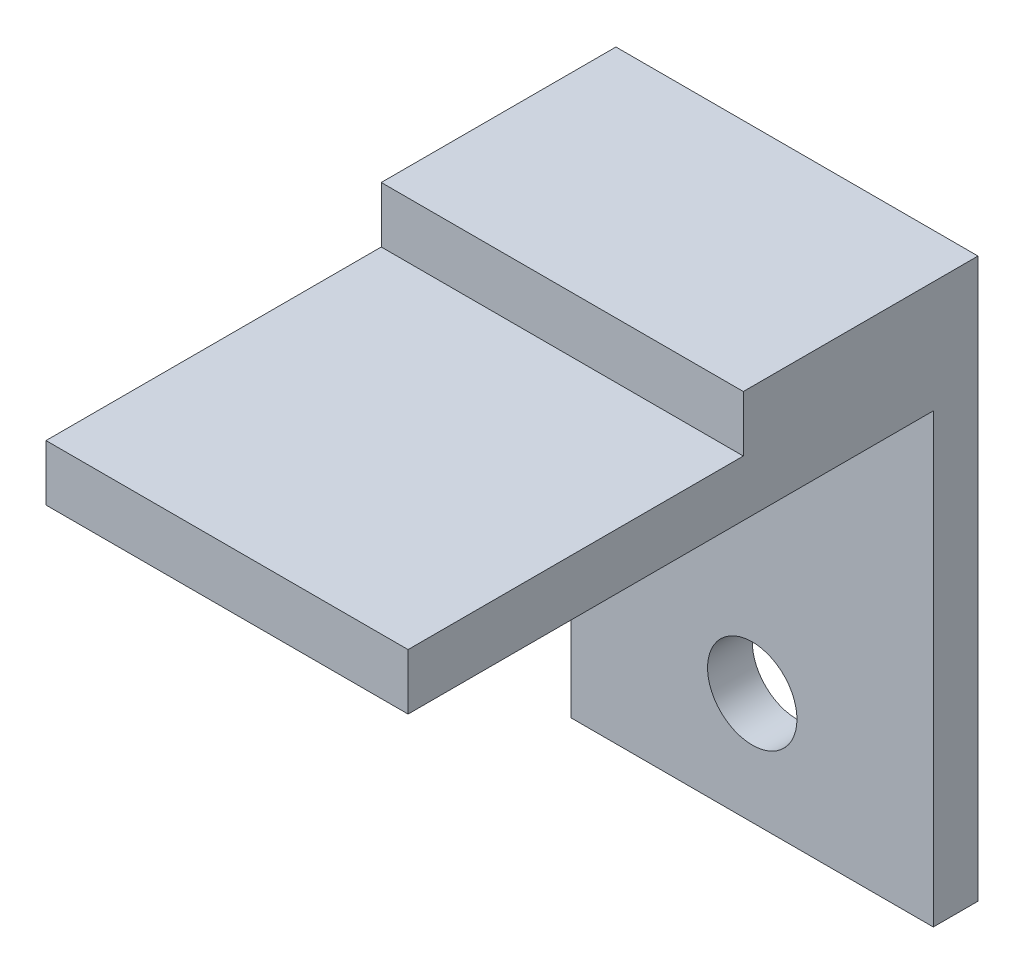
ISO-10303-21;
HEADER;
FILE_DESCRIPTION(('STEP AP214'),'2;1');
FILE_NAME('part.step','',(''),(''),'','','');
FILE_SCHEMA(('AUTOMOTIVE_DESIGN { 1 0 10303 214 1 1 1 1 }'));
ENDSEC;
DATA;
#1=APPLICATION_CONTEXT('core data for automotive mechanical design processes');
#2=APPLICATION_PROTOCOL_DEFINITION('international standard','automotive_design',2000,#1);
#3=PRODUCT_CONTEXT('',#1,'mechanical');
#4=PRODUCT('Part','Part','',(#3));
#5=PRODUCT_RELATED_PRODUCT_CATEGORY('part','',(#4));
#6=PRODUCT_DEFINITION_FORMATION('','',#4);
#7=PRODUCT_DEFINITION_CONTEXT('part definition',#1,'design');
#8=PRODUCT_DEFINITION('design','',#6,#7);
#9=PRODUCT_DEFINITION_SHAPE('','',#8);
#10=(LENGTH_UNIT() NAMED_UNIT(*) SI_UNIT(.MILLI.,.METRE.));
#11=(NAMED_UNIT(*) PLANE_ANGLE_UNIT() SI_UNIT($,.RADIAN.));
#12=(NAMED_UNIT(*) SI_UNIT($,.STERADIAN.) SOLID_ANGLE_UNIT());
#13=UNCERTAINTY_MEASURE_WITH_UNIT(LENGTH_MEASURE(1.E-05),#10,'distance_accuracy_value','');
#14=(GEOMETRIC_REPRESENTATION_CONTEXT(3) GLOBAL_UNCERTAINTY_ASSIGNED_CONTEXT((#13)) GLOBAL_UNIT_ASSIGNED_CONTEXT((#10,
#11,#12)) REPRESENTATION_CONTEXT('',''));
#15=CARTESIAN_POINT('',(0.,0.,0.));
#16=DIRECTION('',(0.,0.,1.));
#17=DIRECTION('',(1.,0.,0.));
#18=AXIS2_PLACEMENT_3D('',#15,#16,#17);
#19=CARTESIAN_POINT('',(0.,9.99999999999999,25.5));
#20=DIRECTION('',(0.,-1.,0.));
#21=DIRECTION('',(1.,0.,0.));
#22=AXIS2_PLACEMENT_3D('',#19,#20,#21);
#23=PLANE('',#22);
#24=DIRECTION('',(-1.,0.,0.));
#25=VECTOR('',#24,1.);
#26=CARTESIAN_POINT('',(0.,9.99999999999999,25.5));
#27=LINE('',#26,#25);
#28=CARTESIAN_POINT('',(8.1,10.,25.5));
#29=VERTEX_POINT('',#28);
#30=CARTESIAN_POINT('',(-8.1,9.99999999999999,25.5));
#31=VERTEX_POINT('',#30);
#32=EDGE_CURVE('E136',#29,#31,#27,.T.);
#33=ORIENTED_EDGE('',*,*,#32,.F.);
#34=DIRECTION('',(0.,0.,-1.));
#35=VECTOR('',#34,1.);
#36=CARTESIAN_POINT('',(8.1,10.,25.5));
#37=LINE('',#36,#35);
#38=CARTESIAN_POINT('',(8.1,10.,10.5));
#39=VERTEX_POINT('',#38);
#40=EDGE_CURVE('E138',#29,#39,#37,.T.);
#41=ORIENTED_EDGE('',*,*,#40,.T.);
#42=DIRECTION('',(-1.,0.,0.));
#43=VECTOR('',#42,1.);
#44=CARTESIAN_POINT('',(0.,9.99999999999999,10.5));
#45=LINE('',#44,#43);
#46=CARTESIAN_POINT('',(-8.1,9.99999999999999,10.5));
#47=VERTEX_POINT('',#46);
#48=EDGE_CURVE('E11',#39,#47,#45,.T.);
#49=ORIENTED_EDGE('',*,*,#48,.T.);
#50=DIRECTION('',(0.,0.,-1.));
#51=VECTOR('',#50,1.);
#52=CARTESIAN_POINT('',(-8.1,9.99999999999999,25.5));
#53=LINE('',#52,#51);
#54=EDGE_CURVE('E48',#31,#47,#53,.T.);
#55=ORIENTED_EDGE('',*,*,#54,.F.);
#56=EDGE_LOOP('',(#33,#41,#49,#55));
#57=FACE_BOUND('',#56,.T.);
#58=ADVANCED_FACE('F45',(#57),#23,.F.);
#59=CARTESIAN_POINT('',(-8.1,0.,25.5));
#60=DIRECTION('',(1.,0.,0.));
#61=DIRECTION('',(0.,1.,0.));
#62=AXIS2_PLACEMENT_3D('',#59,#60,#61);
#63=PLANE('',#62);
#64=DIRECTION('',(0.,-1.,0.));
#65=VECTOR('',#64,1.);
#66=CARTESIAN_POINT('',(-8.1,0.,0.));
#67=LINE('',#66,#65);
#68=CARTESIAN_POINT('',(-8.1,12.5,0.));
#69=VERTEX_POINT('',#68);
#70=CARTESIAN_POINT('',(-8.10000000000001,-12.5,0.));
#71=VERTEX_POINT('',#70);
#72=EDGE_CURVE('E145',#69,#71,#67,.T.);
#73=ORIENTED_EDGE('',*,*,#72,.T.);
#74=DIRECTION('',(0.,0.,-1.));
#75=VECTOR('',#74,1.);
#76=CARTESIAN_POINT('',(-8.10000000000001,-12.5,2.));
#77=LINE('',#76,#75);
#78=CARTESIAN_POINT('',(-8.10000000000001,-12.5,2.));
#79=VERTEX_POINT('',#78);
#80=EDGE_CURVE('E250',#79,#71,#77,.T.);
#81=ORIENTED_EDGE('',*,*,#80,.F.);
#82=DIRECTION('',(0.,-1.,0.));
#83=VECTOR('',#82,1.);
#84=CARTESIAN_POINT('',(-8.1,0.,2.));
#85=LINE('',#84,#83);
#86=CARTESIAN_POINT('',(-8.1,7.5,2.));
#87=VERTEX_POINT('',#86);
#88=EDGE_CURVE('E258',#87,#79,#85,.T.);
#89=ORIENTED_EDGE('',*,*,#88,.F.);
#90=DIRECTION('',(0.,0.,-1.));
#91=VECTOR('',#90,1.);
#92=CARTESIAN_POINT('',(-8.1,7.5,25.5));
#93=LINE('',#92,#91);
#94=CARTESIAN_POINT('',(-8.1,7.5,25.5));
#95=VERTEX_POINT('',#94);
#96=EDGE_CURVE('E269',#95,#87,#93,.T.);
#97=ORIENTED_EDGE('',*,*,#96,.F.);
#98=DIRECTION('',(0.,-1.,0.));
#99=VECTOR('',#98,1.);
#100=CARTESIAN_POINT('',(-8.1,0.,25.5));
#101=LINE('',#100,#99);
#102=EDGE_CURVE('E144',#31,#95,#101,.T.);
#103=ORIENTED_EDGE('',*,*,#102,.F.);
#104=ORIENTED_EDGE('',*,*,#54,.T.);
#105=DIRECTION('',(0.,-1.,0.));
#106=VECTOR('',#105,1.);
#107=CARTESIAN_POINT('',(-8.1,0.,10.5));
#108=LINE('',#107,#106);
#109=CARTESIAN_POINT('',(-8.1,12.5,10.5));
#110=VERTEX_POINT('',#109);
#111=EDGE_CURVE('E69',#110,#47,#108,.T.);
#112=ORIENTED_EDGE('',*,*,#111,.F.);
#113=DIRECTION('',(0.,0.,-1.));
#114=VECTOR('',#113,1.);
#115=CARTESIAN_POINT('',(-8.1,12.5,10.5));
#116=LINE('',#115,#114);
#117=EDGE_CURVE('E176',#110,#69,#116,.T.);
#118=ORIENTED_EDGE('',*,*,#117,.T.);
#119=EDGE_LOOP('',(#73,#81,#89,#97,#103,#104,#112,#118));
#120=FACE_BOUND('',#119,.T.);
#121=ADVANCED_FACE('F275',(#120),#63,.F.);
#122=CARTESIAN_POINT('',(0.,7.5,25.5));
#123=DIRECTION('',(0.,-1.,0.));
#124=DIRECTION('',(1.,0.,0.));
#125=AXIS2_PLACEMENT_3D('',#122,#123,#124);
#126=PLANE('',#125);
#127=DIRECTION('',(-1.,0.,0.));
#128=VECTOR('',#127,1.);
#129=CARTESIAN_POINT('',(0.,7.5,2.));
#130=LINE('',#129,#128);
#131=CARTESIAN_POINT('',(8.1,7.5,2.));
#132=VERTEX_POINT('',#131);
#133=EDGE_CURVE('E54',#132,#87,#130,.T.);
#134=ORIENTED_EDGE('',*,*,#133,.F.);
#135=DIRECTION('',(0.,0.,-1.));
#136=VECTOR('',#135,1.);
#137=CARTESIAN_POINT('',(8.1,7.5,25.5));
#138=LINE('',#137,#136);
#139=CARTESIAN_POINT('',(8.1,7.5,25.5));
#140=VERTEX_POINT('',#139);
#141=EDGE_CURVE('E158',#140,#132,#138,.T.);
#142=ORIENTED_EDGE('',*,*,#141,.F.);
#143=DIRECTION('',(-1.,0.,0.));
#144=VECTOR('',#143,1.);
#145=CARTESIAN_POINT('',(0.,7.5,25.5));
#146=LINE('',#145,#144);
#147=EDGE_CURVE('E162',#140,#95,#146,.T.);
#148=ORIENTED_EDGE('',*,*,#147,.T.);
#149=ORIENTED_EDGE('',*,*,#96,.T.);
#150=EDGE_LOOP('',(#134,#142,#148,#149));
#151=FACE_BOUND('',#150,.T.);
#152=ADVANCED_FACE('F278',(#151),#126,.T.);
#153=CARTESIAN_POINT('',(0.,0.,25.5));
#154=DIRECTION('',(0.,0.,1.));
#155=DIRECTION('',(1.,0.,0.));
#156=AXIS2_PLACEMENT_3D('',#153,#154,#155);
#157=PLANE('',#156);
#158=ORIENTED_EDGE('',*,*,#147,.F.);
#159=DIRECTION('',(0.,-1.,0.));
#160=VECTOR('',#159,1.);
#161=CARTESIAN_POINT('',(8.1,0.,25.5));
#162=LINE('',#161,#160);
#163=EDGE_CURVE('E153',#29,#140,#162,.T.);
#164=ORIENTED_EDGE('',*,*,#163,.F.);
#165=ORIENTED_EDGE('',*,*,#32,.T.);
#166=ORIENTED_EDGE('',*,*,#102,.T.);
#167=EDGE_LOOP('',(#158,#164,#165,#166));
#168=FACE_BOUND('',#167,.T.);
#169=ADVANCED_FACE('F160',(#168),#157,.T.);
#170=CARTESIAN_POINT('',(0.,0.,0.));
#171=DIRECTION('',(0.,0.,1.));
#172=DIRECTION('',(1.,0.,0.));
#173=AXIS2_PLACEMENT_3D('',#170,#171,#172);
#174=PLANE('',#173);
#175=DIRECTION('',(0.,-1.,0.));
#176=VECTOR('',#175,1.);
#177=CARTESIAN_POINT('',(8.1,0.,0.));
#178=LINE('',#177,#176);
#179=CARTESIAN_POINT('',(8.1,12.5,0.));
#180=VERTEX_POINT('',#179);
#181=CARTESIAN_POINT('',(8.1,-12.5,0.));
#182=VERTEX_POINT('',#181);
#183=EDGE_CURVE('E254',#180,#182,#178,.T.);
#184=ORIENTED_EDGE('',*,*,#183,.T.);
#185=DIRECTION('',(1.,0.,0.));
#186=VECTOR('',#185,1.);
#187=CARTESIAN_POINT('',(0.,-12.5,0.));
#188=LINE('',#187,#186);
#189=EDGE_CURVE('E237',#71,#182,#188,.T.);
#190=ORIENTED_EDGE('',*,*,#189,.F.);
#191=ORIENTED_EDGE('',*,*,#72,.F.);
#192=DIRECTION('',(1.,0.,0.));
#193=VECTOR('',#192,1.);
#194=CARTESIAN_POINT('',(0.,12.5,0.));
#195=LINE('',#194,#193);
#196=EDGE_CURVE('E157',#69,#180,#195,.T.);
#197=ORIENTED_EDGE('',*,*,#196,.T.);
#198=EDGE_LOOP('',(#184,#190,#191,#197));
#199=FACE_BOUND('',#198,.T.);
#200=DIRECTION('',(0.,-1.,0.));
#201=VECTOR('',#200,1.);
#202=CARTESIAN_POINT('',(1.,0.,0.));
#203=LINE('',#202,#201);
#204=CARTESIAN_POINT('',(1.,-0.499999999999997,0.));
#205=VERTEX_POINT('',#204);
#206=CARTESIAN_POINT('',(1.,-2.5,0.));
#207=VERTEX_POINT('',#206);
#208=EDGE_CURVE('E187',#205,#207,#203,.T.);
#209=ORIENTED_EDGE('',*,*,#208,.F.);
#210=DIRECTION('',(1.,0.,0.));
#211=VECTOR('',#210,1.);
#212=CARTESIAN_POINT('',(0.,-0.499999999999997,0.));
#213=LINE('',#212,#211);
#214=CARTESIAN_POINT('',(-1.,-0.499999999999996,0.));
#215=VERTEX_POINT('',#214);
#216=EDGE_CURVE('E207',#215,#205,#213,.T.);
#217=ORIENTED_EDGE('',*,*,#216,.F.);
#218=DIRECTION('',(0.,-1.,0.));
#219=VECTOR('',#218,1.);
#220=CARTESIAN_POINT('',(-1.,0.,0.));
#221=LINE('',#220,#219);
#222=CARTESIAN_POINT('',(-1.,-2.5,0.));
#223=VERTEX_POINT('',#222);
#224=EDGE_CURVE('E211',#215,#223,#221,.T.);
#225=ORIENTED_EDGE('',*,*,#224,.T.);
#226=DIRECTION('',(1.,0.,0.));
#227=VECTOR('',#226,1.);
#228=CARTESIAN_POINT('',(0.,-2.5,0.));
#229=LINE('',#228,#227);
#230=EDGE_CURVE('E192',#223,#207,#229,.T.);
#231=ORIENTED_EDGE('',*,*,#230,.T.);
#232=EDGE_LOOP('',(#209,#217,#225,#231));
#233=FACE_BOUND('',#232,.T.);
#234=CARTESIAN_POINT('',(0.,-7.5,0.));
#235=DIRECTION('',(0.,0.,1.));
#236=DIRECTION('',(1.,0.,0.));
#237=AXIS2_PLACEMENT_3D('',#234,#235,#236);
#238=CIRCLE('',#237,2.);
#239=CARTESIAN_POINT('',(2.,-7.5,0.));
#240=VERTEX_POINT('',#239);
#241=EDGE_CURVE('E220',#240,#240,#238,.T.);
#242=ORIENTED_EDGE('',*,*,#241,.T.);
#243=EDGE_LOOP('',(#242));
#244=FACE_BOUND('',#243,.T.);
#245=ADVANCED_FACE('F288',(#199,#233,#244),#174,.F.);
#246=CARTESIAN_POINT('',(8.1,0.,2.));
#247=DIRECTION('',(1.,0.,0.));
#248=DIRECTION('',(0.,0.,-1.));
#249=AXIS2_PLACEMENT_3D('',#246,#247,#248);
#250=PLANE('',#249);
#251=DIRECTION('',(0.,0.,-1.));
#252=VECTOR('',#251,1.);
#253=CARTESIAN_POINT('',(8.1,-12.5,2.));
#254=LINE('',#253,#252);
#255=CARTESIAN_POINT('',(8.1,-12.5,2.));
#256=VERTEX_POINT('',#255);
#257=EDGE_CURVE('E241',#256,#182,#254,.T.);
#258=ORIENTED_EDGE('',*,*,#257,.T.);
#259=ORIENTED_EDGE('',*,*,#183,.F.);
#260=DIRECTION('',(0.,0.,-1.));
#261=VECTOR('',#260,1.);
#262=CARTESIAN_POINT('',(8.1,12.5,10.5));
#263=LINE('',#262,#261);
#264=CARTESIAN_POINT('',(8.1,12.5,10.5));
#265=VERTEX_POINT('',#264);
#266=EDGE_CURVE('E183',#265,#180,#263,.T.);
#267=ORIENTED_EDGE('',*,*,#266,.F.);
#268=DIRECTION('',(0.,-1.,0.));
#269=VECTOR('',#268,1.);
#270=CARTESIAN_POINT('',(8.1,0.,10.5));
#271=LINE('',#270,#269);
#272=EDGE_CURVE('E155',#265,#39,#271,.T.);
#273=ORIENTED_EDGE('',*,*,#272,.T.);
#274=ORIENTED_EDGE('',*,*,#40,.F.);
#275=ORIENTED_EDGE('',*,*,#163,.T.);
#276=ORIENTED_EDGE('',*,*,#141,.T.);
#277=DIRECTION('',(0.,-1.,0.));
#278=VECTOR('',#277,1.);
#279=CARTESIAN_POINT('',(8.1,0.,2.));
#280=LINE('',#279,#278);
#281=EDGE_CURVE('E255',#132,#256,#280,.T.);
#282=ORIENTED_EDGE('',*,*,#281,.T.);
#283=EDGE_LOOP('',(#258,#259,#267,#273,#274,#275,#276,#282));
#284=FACE_BOUND('',#283,.T.);
#285=ADVANCED_FACE('F151',(#284),#250,.T.);
#286=CARTESIAN_POINT('',(0.,0.,2.));
#287=DIRECTION('',(0.,0.,1.));
#288=DIRECTION('',(1.,0.,0.));
#289=AXIS2_PLACEMENT_3D('',#286,#287,#288);
#290=PLANE('',#289);
#291=ORIENTED_EDGE('',*,*,#281,.F.);
#292=ORIENTED_EDGE('',*,*,#133,.T.);
#293=ORIENTED_EDGE('',*,*,#88,.T.);
#294=DIRECTION('',(1.,0.,0.));
#295=VECTOR('',#294,1.);
#296=CARTESIAN_POINT('',(0.,-12.5,2.));
#297=LINE('',#296,#295);
#298=EDGE_CURVE('E236',#79,#256,#297,.T.);
#299=ORIENTED_EDGE('',*,*,#298,.T.);
#300=EDGE_LOOP('',(#291,#292,#293,#299));
#301=FACE_BOUND('',#300,.T.);
#302=CARTESIAN_POINT('',(0.,-7.5,2.));
#303=DIRECTION('',(0.,0.,1.));
#304=DIRECTION('',(1.,0.,0.));
#305=AXIS2_PLACEMENT_3D('',#302,#303,#304);
#306=CIRCLE('',#305,2.);
#307=CARTESIAN_POINT('',(2.,-7.5,2.));
#308=VERTEX_POINT('',#307);
#309=EDGE_CURVE('E232',#308,#308,#306,.T.);
#310=ORIENTED_EDGE('',*,*,#309,.F.);
#311=EDGE_LOOP('',(#310));
#312=FACE_BOUND('',#311,.T.);
#313=ADVANCED_FACE('F282',(#301,#312),#290,.T.);
#314=CARTESIAN_POINT('',(0.,-12.5,2.));
#315=DIRECTION('',(0.,1.,0.));
#316=DIRECTION('',(-1.,0.,0.));
#317=AXIS2_PLACEMENT_3D('',#314,#315,#316);
#318=PLANE('',#317);
#319=ORIENTED_EDGE('',*,*,#189,.T.);
#320=ORIENTED_EDGE('',*,*,#257,.F.);
#321=ORIENTED_EDGE('',*,*,#298,.F.);
#322=ORIENTED_EDGE('',*,*,#80,.T.);
#323=EDGE_LOOP('',(#319,#320,#321,#322));
#324=FACE_BOUND('',#323,.T.);
#325=ADVANCED_FACE('F285',(#324),#318,.F.);
#326=CARTESIAN_POINT('',(0.,-7.5,2.));
#327=DIRECTION('',(0.,0.,-1.));
#328=DIRECTION('',(-1.,0.,0.));
#329=AXIS2_PLACEMENT_3D('',#326,#327,#328);
#330=CYLINDRICAL_SURFACE('',#329,2.);
#331=ORIENTED_EDGE('',*,*,#309,.T.);
#332=EDGE_LOOP('',(#331));
#333=FACE_BOUND('',#332,.T.);
#334=ORIENTED_EDGE('',*,*,#241,.F.);
#335=EDGE_LOOP('',(#334));
#336=FACE_BOUND('',#335,.T.);
#337=ADVANCED_FACE('F318',(#333,#336),#330,.F.);
#338=CARTESIAN_POINT('',(1.,0.,-1.5));
#339=DIRECTION('',(-1.,0.,0.));
#340=DIRECTION('',(0.,-1.,0.));
#341=AXIS2_PLACEMENT_3D('',#338,#339,#340);
#342=PLANE('',#341);
#343=ORIENTED_EDGE('',*,*,#208,.T.);
#344=DIRECTION('',(0.,0.,1.));
#345=VECTOR('',#344,1.);
#346=CARTESIAN_POINT('',(1.,-2.5,-1.5));
#347=LINE('',#346,#345);
#348=CARTESIAN_POINT('',(1.,-2.5,-1.5));
#349=VERTEX_POINT('',#348);
#350=EDGE_CURVE('E216',#349,#207,#347,.T.);
#351=ORIENTED_EDGE('',*,*,#350,.F.);
#352=DIRECTION('',(0.,-1.,0.));
#353=VECTOR('',#352,1.);
#354=CARTESIAN_POINT('',(1.,0.,-1.5));
#355=LINE('',#354,#353);
#356=CARTESIAN_POINT('',(1.,-0.499999999999997,-1.5));
#357=VERTEX_POINT('',#356);
#358=EDGE_CURVE('E188',#357,#349,#355,.T.);
#359=ORIENTED_EDGE('',*,*,#358,.F.);
#360=DIRECTION('',(0.,0.,1.));
#361=VECTOR('',#360,1.);
#362=CARTESIAN_POINT('',(1.,-0.499999999999997,-1.5));
#363=LINE('',#362,#361);
#364=EDGE_CURVE('E203',#357,#205,#363,.T.);
#365=ORIENTED_EDGE('',*,*,#364,.T.);
#366=EDGE_LOOP('',(#343,#351,#359,#365));
#367=FACE_BOUND('',#366,.T.);
#368=ADVANCED_FACE('F321',(#367),#342,.F.);
#369=CARTESIAN_POINT('',(0.,-2.5,-1.5));
#370=DIRECTION('',(0.,-1.,0.));
#371=DIRECTION('',(1.,0.,0.));
#372=AXIS2_PLACEMENT_3D('',#369,#370,#371);
#373=PLANE('',#372);
#374=ORIENTED_EDGE('',*,*,#230,.F.);
#375=DIRECTION('',(0.,0.,1.));
#376=VECTOR('',#375,1.);
#377=CARTESIAN_POINT('',(-1.,-2.5,-1.5));
#378=LINE('',#377,#376);
#379=CARTESIAN_POINT('',(-1.,-2.5,-1.5));
#380=VERTEX_POINT('',#379);
#381=EDGE_CURVE('E221',#380,#223,#378,.T.);
#382=ORIENTED_EDGE('',*,*,#381,.F.);
#383=DIRECTION('',(1.,0.,0.));
#384=VECTOR('',#383,1.);
#385=CARTESIAN_POINT('',(0.,-2.5,-1.5));
#386=LINE('',#385,#384);
#387=EDGE_CURVE('E199',#380,#349,#386,.T.);
#388=ORIENTED_EDGE('',*,*,#387,.T.);
#389=ORIENTED_EDGE('',*,*,#350,.T.);
#390=EDGE_LOOP('',(#374,#382,#388,#389));
#391=FACE_BOUND('',#390,.T.);
#392=ADVANCED_FACE('F327',(#391),#373,.T.);
#393=CARTESIAN_POINT('',(-1.,0.,-1.5));
#394=DIRECTION('',(-1.,0.,0.));
#395=DIRECTION('',(0.,-1.,0.));
#396=AXIS2_PLACEMENT_3D('',#393,#394,#395);
#397=PLANE('',#396);
#398=ORIENTED_EDGE('',*,*,#224,.F.);
#399=DIRECTION('',(0.,0.,1.));
#400=VECTOR('',#399,1.);
#401=CARTESIAN_POINT('',(-1.,-0.499999999999996,-1.5));
#402=LINE('',#401,#400);
#403=CARTESIAN_POINT('',(-1.,-0.499999999999996,-1.5));
#404=VERTEX_POINT('',#403);
#405=EDGE_CURVE('E225',#404,#215,#402,.T.);
#406=ORIENTED_EDGE('',*,*,#405,.F.);
#407=DIRECTION('',(0.,-1.,0.));
#408=VECTOR('',#407,1.);
#409=CARTESIAN_POINT('',(-1.,0.,-1.5));
#410=LINE('',#409,#408);
#411=EDGE_CURVE('E195',#404,#380,#410,.T.);
#412=ORIENTED_EDGE('',*,*,#411,.T.);
#413=ORIENTED_EDGE('',*,*,#381,.T.);
#414=EDGE_LOOP('',(#398,#406,#412,#413));
#415=FACE_BOUND('',#414,.T.);
#416=ADVANCED_FACE('F332',(#415),#397,.T.);
#417=CARTESIAN_POINT('',(0.,-0.499999999999997,-1.5));
#418=DIRECTION('',(0.,-1.,0.));
#419=DIRECTION('',(1.,0.,0.));
#420=AXIS2_PLACEMENT_3D('',#417,#418,#419);
#421=PLANE('',#420);
#422=ORIENTED_EDGE('',*,*,#216,.T.);
#423=ORIENTED_EDGE('',*,*,#364,.F.);
#424=DIRECTION('',(1.,0.,0.));
#425=VECTOR('',#424,1.);
#426=CARTESIAN_POINT('',(0.,-0.499999999999997,-1.5));
#427=LINE('',#426,#425);
#428=EDGE_CURVE('E191',#404,#357,#427,.T.);
#429=ORIENTED_EDGE('',*,*,#428,.F.);
#430=ORIENTED_EDGE('',*,*,#405,.T.);
#431=EDGE_LOOP('',(#422,#423,#429,#430));
#432=FACE_BOUND('',#431,.T.);
#433=ADVANCED_FACE('F329',(#432),#421,.F.);
#434=CARTESIAN_POINT('',(0.,0.,-1.5));
#435=DIRECTION('',(0.,0.,1.));
#436=DIRECTION('',(1.,0.,0.));
#437=AXIS2_PLACEMENT_3D('',#434,#435,#436);
#438=PLANE('',#437);
#439=ORIENTED_EDGE('',*,*,#358,.T.);
#440=ORIENTED_EDGE('',*,*,#387,.F.);
#441=ORIENTED_EDGE('',*,*,#411,.F.);
#442=ORIENTED_EDGE('',*,*,#428,.T.);
#443=EDGE_LOOP('',(#439,#440,#441,#442));
#444=FACE_BOUND('',#443,.T.);
#445=ADVANCED_FACE('F299',(#444),#438,.F.);
#446=CARTESIAN_POINT('',(0.,12.5,10.5));
#447=DIRECTION('',(0.,1.,0.));
#448=DIRECTION('',(-1.,0.,0.));
#449=AXIS2_PLACEMENT_3D('',#446,#447,#448);
#450=PLANE('',#449);
#451=ORIENTED_EDGE('',*,*,#196,.F.);
#452=ORIENTED_EDGE('',*,*,#117,.F.);
#453=DIRECTION('',(1.,0.,0.));
#454=VECTOR('',#453,1.);
#455=CARTESIAN_POINT('',(0.,12.5,10.5));
#456=LINE('',#455,#454);
#457=EDGE_CURVE('E170',#110,#265,#456,.T.);
#458=ORIENTED_EDGE('',*,*,#457,.T.);
#459=ORIENTED_EDGE('',*,*,#266,.T.);
#460=EDGE_LOOP('',(#451,#452,#458,#459));
#461=FACE_BOUND('',#460,.T.);
#462=ADVANCED_FACE('F292',(#461),#450,.T.);
#463=CARTESIAN_POINT('',(0.,0.,10.5));
#464=DIRECTION('',(0.,0.,1.));
#465=DIRECTION('',(1.,0.,0.));
#466=AXIS2_PLACEMENT_3D('',#463,#464,#465);
#467=PLANE('',#466);
#468=ORIENTED_EDGE('',*,*,#48,.F.);
#469=ORIENTED_EDGE('',*,*,#272,.F.);
#470=ORIENTED_EDGE('',*,*,#457,.F.);
#471=ORIENTED_EDGE('',*,*,#111,.T.);
#472=EDGE_LOOP('',(#468,#469,#470,#471));
#473=FACE_BOUND('',#472,.T.);
#474=ADVANCED_FACE('F293',(#473),#467,.T.);
#475=CLOSED_SHELL('',(#58,#121,#152,#169,#245,#285,#313,#325,#337,#368,#392,#416,#433,#445,#462,#474));
#476=MANIFOLD_SOLID_BREP('B2',#475);
#477=ADVANCED_BREP_SHAPE_REPRESENTATION('',(#18,#476),#14);
#478=SHAPE_DEFINITION_REPRESENTATION(#9,#477);
ENDSEC;
END-ISO-10303-21;
